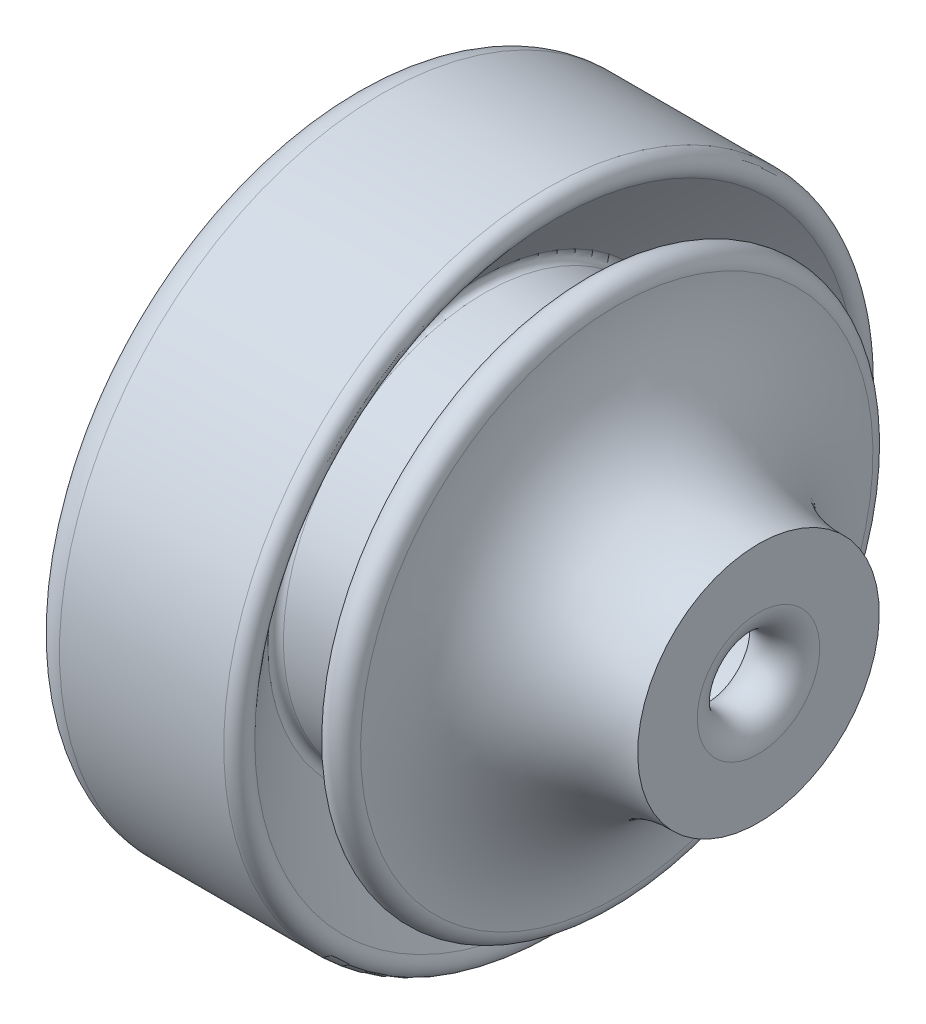
ISO-10303-21;
HEADER;
FILE_DESCRIPTION(('STEP AP214'),'2;1');
FILE_NAME('part.step','',(''),(''),'','','');
FILE_SCHEMA(('AUTOMOTIVE_DESIGN { 1 0 10303 214 1 1 1 1 }'));
ENDSEC;
DATA;
#1=APPLICATION_CONTEXT('core data for automotive mechanical design processes');
#2=APPLICATION_PROTOCOL_DEFINITION('international standard','automotive_design',2000,#1);
#3=PRODUCT_CONTEXT('',#1,'mechanical');
#4=PRODUCT('Part','Part','',(#3));
#5=PRODUCT_RELATED_PRODUCT_CATEGORY('part','',(#4));
#6=PRODUCT_DEFINITION_FORMATION('','',#4);
#7=PRODUCT_DEFINITION_CONTEXT('part definition',#1,'design');
#8=PRODUCT_DEFINITION('design','',#6,#7);
#9=PRODUCT_DEFINITION_SHAPE('','',#8);
#10=(LENGTH_UNIT() NAMED_UNIT(*) SI_UNIT(.MILLI.,.METRE.));
#11=(NAMED_UNIT(*) PLANE_ANGLE_UNIT() SI_UNIT($,.RADIAN.));
#12=(NAMED_UNIT(*) SI_UNIT($,.STERADIAN.) SOLID_ANGLE_UNIT());
#13=UNCERTAINTY_MEASURE_WITH_UNIT(LENGTH_MEASURE(1.E-05),#10,'distance_accuracy_value','');
#14=(GEOMETRIC_REPRESENTATION_CONTEXT(3) GLOBAL_UNCERTAINTY_ASSIGNED_CONTEXT((#13)) GLOBAL_UNIT_ASSIGNED_CONTEXT((#10,
#11,#12)) REPRESENTATION_CONTEXT('',''));
#15=CARTESIAN_POINT('',(0.,0.,0.));
#16=DIRECTION('',(0.,0.,1.));
#17=DIRECTION('',(1.,0.,0.));
#18=AXIS2_PLACEMENT_3D('',#15,#16,#17);
#19=CARTESIAN_POINT('',(-4.51017810434329,0.,0.));
#20=DIRECTION('',(1.,0.,0.));
#21=DIRECTION('',(0.,1.,0.));
#22=AXIS2_PLACEMENT_3D('',#19,#20,#21);
#23=CONICAL_SURFACE('',#22,1.56034014462084,1.34472594247803);
#24=CARTESIAN_POINT('',(-4.3,0.,0.));
#25=DIRECTION('',(1.,0.,0.));
#26=DIRECTION('',(0.,1.,0.));
#27=AXIS2_PLACEMENT_3D('',#24,#25,#26);
#28=CIRCLE('',#27,2.4741496384479);
#29=CARTESIAN_POINT('',(-4.3,2.4741496384479,0.));
#30=VERTEX_POINT('',#29);
#31=EDGE_CURVE('E10',#30,#30,#28,.T.);
#32=ORIENTED_EDGE('',*,*,#31,.T.);
#33=EDGE_LOOP('',(#32));
#34=FACE_BOUND('',#33,.T.);
#35=CARTESIAN_POINT('',(-4.51017810434329,0.,0.));
#36=DIRECTION('',(1.,0.,0.));
#37=DIRECTION('',(0.,1.,0.));
#38=AXIS2_PLACEMENT_3D('',#35,#36,#37);
#39=CIRCLE('',#38,1.56034014462084);
#40=CARTESIAN_POINT('',(-4.51017810434329,1.56034014462084,0.));
#41=VERTEX_POINT('',#40);
#42=EDGE_CURVE('E78',#41,#41,#39,.T.);
#43=ORIENTED_EDGE('',*,*,#42,.F.);
#44=EDGE_LOOP('',(#43));
#45=FACE_BOUND('',#44,.T.);
#46=ADVANCED_FACE('F32',(#34,#45),#23,.F.);
#47=CARTESIAN_POINT('',(-3.32544526085823,0.,0.));
#48=DIRECTION('',(1.,0.,0.));
#49=DIRECTION('',(0.,1.,0.));
#50=AXIS2_PLACEMENT_3D('',#47,#48,#49);
#51=TOROIDAL_SURFACE('',#50,2.25,1.);
#52=CARTESIAN_POINT('',(-3.29740240682591,0.,0.));
#53=DIRECTION('',(1.,0.,0.));
#54=DIRECTION('',(0.,1.,0.));
#55=AXIS2_PLACEMENT_3D('',#52,#53,#54);
#56=CIRCLE('',#55,3.249606721835);
#57=CARTESIAN_POINT('',(-3.29740240682591,3.249606721835,0.));
#58=VERTEX_POINT('',#57);
#59=EDGE_CURVE('E38',#58,#58,#56,.T.);
#60=ORIENTED_EDGE('',*,*,#59,.T.);
#61=EDGE_LOOP('',(#60));
#62=FACE_BOUND('',#61,.T.);
#63=ORIENTED_EDGE('',*,*,#31,.F.);
#64=EDGE_LOOP('',(#63));
#65=FACE_BOUND('',#64,.T.);
#66=ADVANCED_FACE('F111',(#62,#65),#51,.F.);
#67=CARTESIAN_POINT('',(-3.29740240682591,0.,0.));
#68=DIRECTION('',(-1.,0.,0.));
#69=DIRECTION('',(0.,-1.,0.));
#70=AXIS2_PLACEMENT_3D('',#67,#68,#69);
#71=CONICAL_SURFACE('',#70,3.249606721835,0.0280465308247898);
#72=CARTESIAN_POINT('',(5.6,0.,0.));
#73=DIRECTION('',(1.,0.,0.));
#74=DIRECTION('',(0.,1.,0.));
#75=AXIS2_PLACEMENT_3D('',#72,#73,#74);
#76=CIRCLE('',#75,3.);
#77=CARTESIAN_POINT('',(5.6,3.,0.));
#78=VERTEX_POINT('',#77);
#79=EDGE_CURVE('E42',#78,#78,#76,.T.);
#80=ORIENTED_EDGE('',*,*,#79,.T.);
#81=EDGE_LOOP('',(#80));
#82=FACE_BOUND('',#81,.T.);
#83=ORIENTED_EDGE('',*,*,#59,.F.);
#84=EDGE_LOOP('',(#83));
#85=FACE_BOUND('',#84,.T.);
#86=ADVANCED_FACE('F115',(#82,#85),#71,.F.);
#87=CARTESIAN_POINT('',(5.6,0.,0.));
#88=DIRECTION('',(1.,0.,0.));
#89=DIRECTION('',(0.,1.,0.));
#90=AXIS2_PLACEMENT_3D('',#87,#88,#89);
#91=PLANE('',#90);
#92=ORIENTED_EDGE('',*,*,#79,.F.);
#93=EDGE_LOOP('',(#92));
#94=FACE_BOUND('',#93,.T.);
#95=CARTESIAN_POINT('',(5.6,0.,0.));
#96=DIRECTION('',(1.,0.,0.));
#97=DIRECTION('',(0.,1.,0.));
#98=AXIS2_PLACEMENT_3D('',#95,#96,#97);
#99=CIRCLE('',#98,1.9);
#100=CARTESIAN_POINT('',(5.6,1.9,0.));
#101=VERTEX_POINT('',#100);
#102=EDGE_CURVE('E46',#101,#101,#99,.T.);
#103=ORIENTED_EDGE('',*,*,#102,.T.);
#104=EDGE_LOOP('',(#103));
#105=FACE_BOUND('',#104,.T.);
#106=ADVANCED_FACE('F236',(#94,#105),#91,.F.);
#107=CARTESIAN_POINT('',(6.5,0.,0.));
#108=DIRECTION('',(1.,0.,0.));
#109=DIRECTION('',(0.,1.,0.));
#110=AXIS2_PLACEMENT_3D('',#107,#108,#109);
#111=TOROIDAL_SURFACE('',#110,1.9,0.9);
#112=CARTESIAN_POINT('',(7.4,0.,0.));
#113=DIRECTION('',(1.,0.,0.));
#114=DIRECTION('',(0.,1.,0.));
#115=AXIS2_PLACEMENT_3D('',#112,#113,#114);
#116=CIRCLE('',#115,1.9);
#117=CARTESIAN_POINT('',(7.4,1.9,0.));
#118=VERTEX_POINT('',#117);
#119=EDGE_CURVE('E51',#118,#118,#116,.T.);
#120=ORIENTED_EDGE('',*,*,#119,.T.);
#121=EDGE_LOOP('',(#120));
#122=FACE_BOUND('',#121,.T.);
#123=ORIENTED_EDGE('',*,*,#102,.F.);
#124=EDGE_LOOP('',(#123));
#125=FACE_BOUND('',#124,.T.);
#126=ADVANCED_FACE('F226',(#122,#125),#111,.T.);
#127=CARTESIAN_POINT('',(7.4,0.,0.));
#128=DIRECTION('',(1.,0.,0.));
#129=DIRECTION('',(0.,1.,0.));
#130=AXIS2_PLACEMENT_3D('',#127,#128,#129);
#131=PLANE('',#130);
#132=CARTESIAN_POINT('',(7.4,0.,0.));
#133=DIRECTION('',(1.,0.,0.));
#134=DIRECTION('',(0.,1.,0.));
#135=AXIS2_PLACEMENT_3D('',#132,#133,#134);
#136=CIRCLE('',#135,3.75);
#137=CARTESIAN_POINT('',(7.4,3.75,0.));
#138=VERTEX_POINT('',#137);
#139=EDGE_CURVE('E54',#138,#138,#136,.T.);
#140=ORIENTED_EDGE('',*,*,#139,.T.);
#141=EDGE_LOOP('',(#140));
#142=FACE_BOUND('',#141,.T.);
#143=ORIENTED_EDGE('',*,*,#119,.F.);
#144=EDGE_LOOP('',(#143));
#145=FACE_BOUND('',#144,.T.);
#146=ADVANCED_FACE('F216',(#142,#145),#131,.T.);
#147=CARTESIAN_POINT('',(7.20777091265828,0.,0.));
#148=DIRECTION('',(1.,0.,0.));
#149=DIRECTION('',(0.,1.,0.));
#150=AXIS2_PLACEMENT_3D('',#147,#148,#149);
#151=TOROIDAL_SURFACE('',#150,7.9533776931645,4.20777091265828);
#152=CARTESIAN_POINT('',(3.,0.,0.));
#153=DIRECTION('',(1.,0.,0.));
#154=DIRECTION('',(0.,1.,0.));
#155=AXIS2_PLACEMENT_3D('',#152,#153,#154);
#156=CIRCLE('',#155,7.9533776931645);
#157=CARTESIAN_POINT('',(3.,7.9533776931645,0.));
#158=VERTEX_POINT('',#157);
#159=EDGE_CURVE('E57',#158,#158,#156,.T.);
#160=ORIENTED_EDGE('',*,*,#159,.T.);
#161=EDGE_LOOP('',(#160));
#162=FACE_BOUND('',#161,.T.);
#163=ORIENTED_EDGE('',*,*,#139,.F.);
#164=EDGE_LOOP('',(#163));
#165=FACE_BOUND('',#164,.T.);
#166=ADVANCED_FACE('F206',(#162,#165),#151,.F.);
#167=CARTESIAN_POINT('',(2.5,0.,0.));
#168=DIRECTION('',(1.,0.,0.));
#169=DIRECTION('',(0.,1.,0.));
#170=AXIS2_PLACEMENT_3D('',#167,#168,#169);
#171=TOROIDAL_SURFACE('',#170,7.9533776931645,0.5);
#172=CARTESIAN_POINT('',(2.,0.,0.));
#173=DIRECTION('',(1.,0.,0.));
#174=DIRECTION('',(0.,1.,0.));
#175=AXIS2_PLACEMENT_3D('',#172,#173,#174);
#176=CIRCLE('',#175,7.9533776931645);
#177=CARTESIAN_POINT('',(2.,7.9533776931645,0.));
#178=VERTEX_POINT('',#177);
#179=EDGE_CURVE('E60',#178,#178,#176,.T.);
#180=ORIENTED_EDGE('',*,*,#179,.T.);
#181=EDGE_LOOP('',(#180));
#182=FACE_BOUND('',#181,.T.);
#183=ORIENTED_EDGE('',*,*,#159,.F.);
#184=EDGE_LOOP('',(#183));
#185=FACE_BOUND('',#184,.T.);
#186=ADVANCED_FACE('F196',(#182,#185),#171,.T.);
#187=CARTESIAN_POINT('',(2.,0.,0.));
#188=DIRECTION('',(1.,0.,0.));
#189=DIRECTION('',(0.,1.,0.));
#190=AXIS2_PLACEMENT_3D('',#187,#188,#189);
#191=PLANE('',#190);
#192=ORIENTED_EDGE('',*,*,#179,.F.);
#193=EDGE_LOOP('',(#192));
#194=FACE_BOUND('',#193,.T.);
#195=CARTESIAN_POINT('',(2.,0.,0.));
#196=DIRECTION('',(1.,0.,0.));
#197=DIRECTION('',(0.,1.,0.));
#198=AXIS2_PLACEMENT_3D('',#195,#196,#197);
#199=CIRCLE('',#198,6.25);
#200=CARTESIAN_POINT('',(2.,6.25,0.));
#201=VERTEX_POINT('',#200);
#202=EDGE_CURVE('E63',#201,#201,#199,.T.);
#203=ORIENTED_EDGE('',*,*,#202,.T.);
#204=EDGE_LOOP('',(#203));
#205=FACE_BOUND('',#204,.T.);
#206=ADVANCED_FACE('F186',(#194,#205),#191,.F.);
#207=CARTESIAN_POINT('',(0.,0.,0.));
#208=DIRECTION('',(1.,0.,0.));
#209=DIRECTION('',(0.,1.,0.));
#210=AXIS2_PLACEMENT_3D('',#207,#208,#209);
#211=CYLINDRICAL_SURFACE('',#210,6.25);
#212=ORIENTED_EDGE('',*,*,#202,.F.);
#213=EDGE_LOOP('',(#212));
#214=FACE_BOUND('',#213,.T.);
#215=CARTESIAN_POINT('',(-1.1,0.,0.));
#216=DIRECTION('',(1.,0.,0.));
#217=DIRECTION('',(0.,1.,0.));
#218=AXIS2_PLACEMENT_3D('',#215,#216,#217);
#219=CIRCLE('',#218,6.25);
#220=CARTESIAN_POINT('',(-1.1,6.25,0.));
#221=VERTEX_POINT('',#220);
#222=EDGE_CURVE('E66',#221,#221,#219,.T.);
#223=ORIENTED_EDGE('',*,*,#222,.T.);
#224=EDGE_LOOP('',(#223));
#225=FACE_BOUND('',#224,.T.);
#226=ADVANCED_FACE('F107',(#214,#225),#211,.T.);
#227=CARTESIAN_POINT('',(-1.1,0.,0.));
#228=DIRECTION('',(1.,0.,0.));
#229=DIRECTION('',(0.,1.,0.));
#230=AXIS2_PLACEMENT_3D('',#227,#228,#229);
#231=TOROIDAL_SURFACE('',#230,6.45,0.2);
#232=ORIENTED_EDGE('',*,*,#222,.F.);
#233=EDGE_LOOP('',(#232));
#234=FACE_BOUND('',#233,.T.);
#235=CARTESIAN_POINT('',(-1.25211661924544,0.,0.));
#236=DIRECTION('',(1.,0.,0.));
#237=DIRECTION('',(0.,1.,0.));
#238=AXIS2_PLACEMENT_3D('',#235,#236,#237);
#239=CIRCLE('',#238,6.57984811954487);
#240=CARTESIAN_POINT('',(-1.25211661924544,6.57984811954487,0.));
#241=VERTEX_POINT('',#240);
#242=EDGE_CURVE('E81',#241,#241,#239,.T.);
#243=ORIENTED_EDGE('',*,*,#242,.T.);
#244=EDGE_LOOP('',(#243));
#245=FACE_BOUND('',#244,.T.);
#246=ADVANCED_FACE('F97',(#234,#245),#231,.F.);
#247=CARTESIAN_POINT('',(0.,0.,0.));
#248=DIRECTION('',(1.,0.,0.));
#249=DIRECTION('',(0.,1.,0.));
#250=AXIS2_PLACEMENT_3D('',#247,#248,#249);
#251=CYLINDRICAL_SURFACE('',#250,10.);
#252=CARTESIAN_POINT('',(-4.3,0.,0.));
#253=DIRECTION('',(1.,0.,0.));
#254=DIRECTION('',(0.,1.,0.));
#255=AXIS2_PLACEMENT_3D('',#252,#253,#254);
#256=CIRCLE('',#255,10.);
#257=CARTESIAN_POINT('',(-4.3,10.,0.));
#258=VERTEX_POINT('',#257);
#259=EDGE_CURVE('E69',#258,#258,#256,.T.);
#260=ORIENTED_EDGE('',*,*,#259,.T.);
#261=EDGE_LOOP('',(#260));
#262=FACE_BOUND('',#261,.T.);
#263=CARTESIAN_POINT('',(0.800000000000002,0.,0.));
#264=DIRECTION('',(1.,0.,0.));
#265=DIRECTION('',(0.,1.,0.));
#266=AXIS2_PLACEMENT_3D('',#263,#264,#265);
#267=CIRCLE('',#266,10.);
#268=CARTESIAN_POINT('',(0.8,10.,0.));
#269=VERTEX_POINT('',#268);
#270=EDGE_CURVE('E87',#269,#269,#267,.T.);
#271=ORIENTED_EDGE('',*,*,#270,.F.);
#272=EDGE_LOOP('',(#271));
#273=FACE_BOUND('',#272,.T.);
#274=ADVANCED_FACE('F94',(#262,#273),#251,.T.);
#275=CARTESIAN_POINT('',(-4.3,0.,0.));
#276=DIRECTION('',(1.,0.,0.));
#277=DIRECTION('',(0.,1.,0.));
#278=AXIS2_PLACEMENT_3D('',#275,#276,#277);
#279=TOROIDAL_SURFACE('',#278,9.,1.);
#280=ORIENTED_EDGE('',*,*,#259,.F.);
#281=EDGE_LOOP('',(#280));
#282=FACE_BOUND('',#281,.T.);
#283=CARTESIAN_POINT('',(-5.3,0.,0.));
#284=DIRECTION('',(1.,0.,0.));
#285=DIRECTION('',(0.,1.,0.));
#286=AXIS2_PLACEMENT_3D('',#283,#284,#285);
#287=CIRCLE('',#286,9.);
#288=CARTESIAN_POINT('',(-5.3,9.,0.));
#289=VERTEX_POINT('',#288);
#290=EDGE_CURVE('E72',#289,#289,#287,.T.);
#291=ORIENTED_EDGE('',*,*,#290,.T.);
#292=EDGE_LOOP('',(#291));
#293=FACE_BOUND('',#292,.T.);
#294=ADVANCED_FACE('F96',(#282,#293),#279,.T.);
#295=CARTESIAN_POINT('',(-5.3,0.,0.));
#296=DIRECTION('',(1.,0.,0.));
#297=DIRECTION('',(0.,1.,0.));
#298=AXIS2_PLACEMENT_3D('',#295,#296,#297);
#299=PLANE('',#298);
#300=ORIENTED_EDGE('',*,*,#290,.F.);
#301=EDGE_LOOP('',(#300));
#302=FACE_BOUND('',#301,.T.);
#303=CARTESIAN_POINT('',(-5.3,0.,0.));
#304=DIRECTION('',(1.,0.,0.));
#305=DIRECTION('',(0.,1.,0.));
#306=AXIS2_PLACEMENT_3D('',#303,#304,#305);
#307=CIRCLE('',#306,1.65);
#308=CARTESIAN_POINT('',(-5.3,1.65,0.));
#309=VERTEX_POINT('',#308);
#310=EDGE_CURVE('E75',#309,#309,#307,.T.);
#311=ORIENTED_EDGE('',*,*,#310,.T.);
#312=EDGE_LOOP('',(#311));
#313=FACE_BOUND('',#312,.T.);
#314=ADVANCED_FACE('F104',(#302,#313),#299,.F.);
#315=CARTESIAN_POINT('',(-4.9,0.,0.));
#316=DIRECTION('',(1.,0.,0.));
#317=DIRECTION('',(0.,1.,0.));
#318=AXIS2_PLACEMENT_3D('',#315,#316,#317);
#319=TOROIDAL_SURFACE('',#318,1.65,0.399999999999999);
#320=ORIENTED_EDGE('',*,*,#42,.T.);
#321=EDGE_LOOP('',(#320));
#322=FACE_BOUND('',#321,.T.);
#323=ORIENTED_EDGE('',*,*,#310,.F.);
#324=EDGE_LOOP('',(#323));
#325=FACE_BOUND('',#324,.T.);
#326=ADVANCED_FACE('F119',(#322,#325),#319,.T.);
#327=CARTESIAN_POINT('',(-1.25211661924544,0.,0.));
#328=DIRECTION('',(1.,0.,0.));
#329=DIRECTION('',(0.,1.,0.));
#330=AXIS2_PLACEMENT_3D('',#327,#328,#329);
#331=CONICAL_SURFACE('',#330,6.57984811954487,0.864210763558938);
#332=CARTESIAN_POINT('',(1.10423323849088,0.,0.));
#333=DIRECTION('',(1.,0.,0.));
#334=DIRECTION('',(0.,1.,0.));
#335=AXIS2_PLACEMENT_3D('',#332,#333,#334);
#336=CIRCLE('',#335,9.34030376091027);
#337=CARTESIAN_POINT('',(1.10423323849088,9.34030376091027,0.));
#338=VERTEX_POINT('',#337);
#339=EDGE_CURVE('E84',#338,#338,#336,.T.);
#340=ORIENTED_EDGE('',*,*,#339,.T.);
#341=EDGE_LOOP('',(#340));
#342=FACE_BOUND('',#341,.T.);
#343=ORIENTED_EDGE('',*,*,#242,.F.);
#344=EDGE_LOOP('',(#343));
#345=FACE_BOUND('',#344,.T.);
#346=ADVANCED_FACE('F122',(#342,#345),#331,.F.);
#347=CARTESIAN_POINT('',(0.800000000000002,0.,0.));
#348=DIRECTION('',(1.,0.,0.));
#349=DIRECTION('',(0.,1.,0.));
#350=AXIS2_PLACEMENT_3D('',#347,#348,#349);
#351=TOROIDAL_SURFACE('',#350,9.6,0.4);
#352=ORIENTED_EDGE('',*,*,#270,.T.);
#353=EDGE_LOOP('',(#352));
#354=FACE_BOUND('',#353,.T.);
#355=ORIENTED_EDGE('',*,*,#339,.F.);
#356=EDGE_LOOP('',(#355));
#357=FACE_BOUND('',#356,.T.);
#358=ADVANCED_FACE('F91',(#354,#357),#351,.T.);
#359=CLOSED_SHELL('',(#46,#66,#86,#106,#126,#146,#166,#186,#206,#226,#246,#274,#294,#314,#326,
#346,#358));
#360=MANIFOLD_SOLID_BREP('B2',#359);
#361=ADVANCED_BREP_SHAPE_REPRESENTATION('',(#18,#360),#14);
#362=SHAPE_DEFINITION_REPRESENTATION(#9,#361);
ENDSEC;
END-ISO-10303-21;
